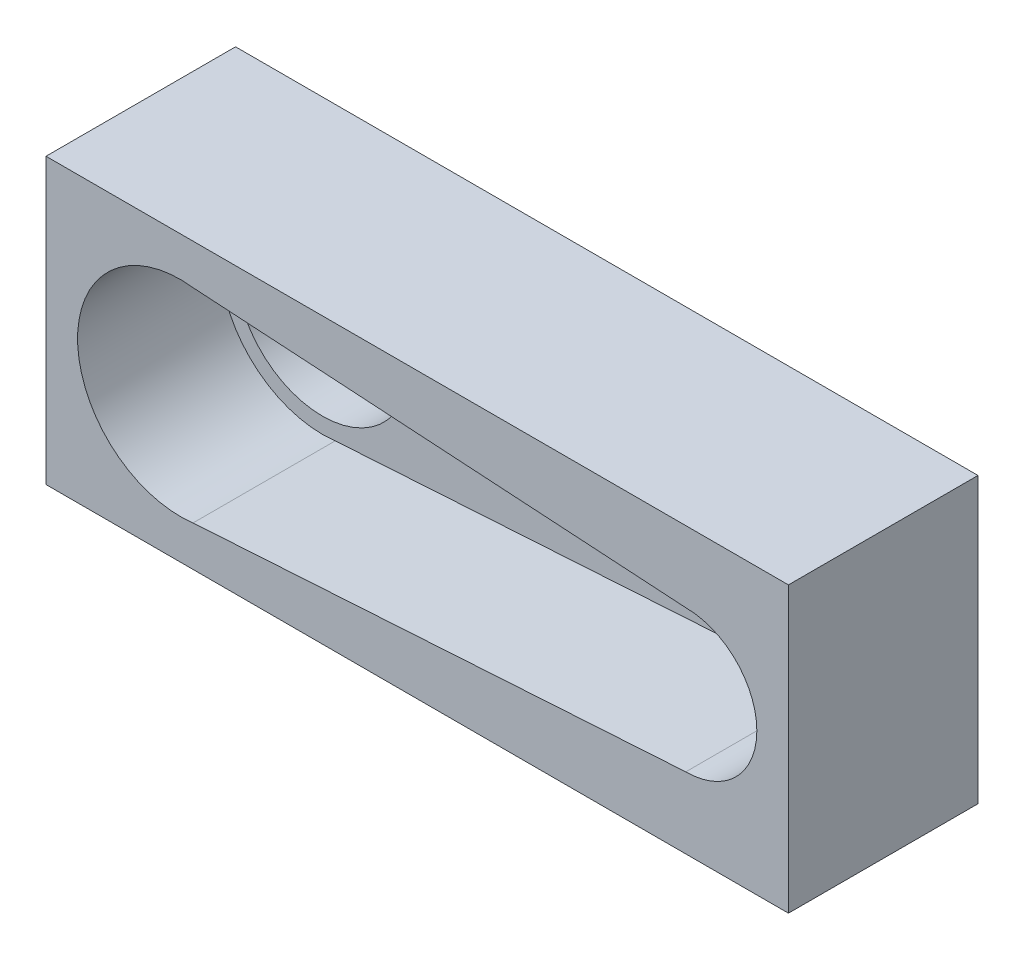
ISO-10303-21;
HEADER;
FILE_DESCRIPTION(('STEP AP214'),'2;1');
FILE_NAME('part.step','',(''),(''),'','','');
FILE_SCHEMA(('AUTOMOTIVE_DESIGN { 1 0 10303 214 1 1 1 1 }'));
ENDSEC;
DATA;
#1=APPLICATION_CONTEXT('core data for automotive mechanical design processes');
#2=APPLICATION_PROTOCOL_DEFINITION('international standard','automotive_design',2000,#1);
#3=PRODUCT_CONTEXT('',#1,'mechanical');
#4=PRODUCT('Part','Part','',(#3));
#5=PRODUCT_RELATED_PRODUCT_CATEGORY('part','',(#4));
#6=PRODUCT_DEFINITION_FORMATION('','',#4);
#7=PRODUCT_DEFINITION_CONTEXT('part definition',#1,'design');
#8=PRODUCT_DEFINITION('design','',#6,#7);
#9=PRODUCT_DEFINITION_SHAPE('','',#8);
#10=(LENGTH_UNIT() NAMED_UNIT(*) SI_UNIT(.MILLI.,.METRE.));
#11=(NAMED_UNIT(*) PLANE_ANGLE_UNIT() SI_UNIT($,.RADIAN.));
#12=(NAMED_UNIT(*) SI_UNIT($,.STERADIAN.) SOLID_ANGLE_UNIT());
#13=UNCERTAINTY_MEASURE_WITH_UNIT(LENGTH_MEASURE(1.E-05),#10,'distance_accuracy_value','');
#14=(GEOMETRIC_REPRESENTATION_CONTEXT(3) GLOBAL_UNCERTAINTY_ASSIGNED_CONTEXT((#13)) GLOBAL_UNIT_ASSIGNED_CONTEXT((#10,
#11,#12)) REPRESENTATION_CONTEXT('',''));
#15=CARTESIAN_POINT('',(0.,0.,0.));
#16=DIRECTION('',(0.,0.,1.));
#17=DIRECTION('',(1.,0.,0.));
#18=AXIS2_PLACEMENT_3D('',#15,#16,#17);
#19=CARTESIAN_POINT('',(0.,0.,9.));
#20=DIRECTION('',(-1.,0.,0.));
#21=DIRECTION('',(0.,-1.,0.));
#22=AXIS2_PLACEMENT_3D('',#19,#20,#21);
#23=PLANE('',#22);
#24=DIRECTION('',(0.,0.,-1.));
#25=VECTOR('',#24,1.);
#26=CARTESIAN_POINT('',(0.,18.,9.));
#27=LINE('',#26,#25);
#28=CARTESIAN_POINT('',(0.,18.,9.));
#29=VERTEX_POINT('',#28);
#30=CARTESIAN_POINT('',(0.,18.,-3.));
#31=VERTEX_POINT('',#30);
#32=EDGE_CURVE('E266',#29,#31,#27,.T.);
#33=ORIENTED_EDGE('',*,*,#32,.T.);
#34=DIRECTION('',(0.,1.,0.));
#35=VECTOR('',#34,1.);
#36=CARTESIAN_POINT('',(0.,0.,-3.));
#37=LINE('',#36,#35);
#38=CARTESIAN_POINT('',(0.,0.,-3.));
#39=VERTEX_POINT('',#38);
#40=EDGE_CURVE('E178',#39,#31,#37,.T.);
#41=ORIENTED_EDGE('',*,*,#40,.F.);
#42=DIRECTION('',(0.,0.,-1.));
#43=VECTOR('',#42,1.);
#44=CARTESIAN_POINT('',(0.,0.,9.));
#45=LINE('',#44,#43);
#46=CARTESIAN_POINT('',(0.,0.,9.));
#47=VERTEX_POINT('',#46);
#48=EDGE_CURVE('E11',#47,#39,#45,.T.);
#49=ORIENTED_EDGE('',*,*,#48,.F.);
#50=DIRECTION('',(0.,1.,0.));
#51=VECTOR('',#50,1.);
#52=CARTESIAN_POINT('',(0.,0.,9.));
#53=LINE('',#52,#51);
#54=EDGE_CURVE('E239',#47,#29,#53,.T.);
#55=ORIENTED_EDGE('',*,*,#54,.T.);
#56=EDGE_LOOP('',(#33,#41,#49,#55));
#57=FACE_BOUND('',#56,.T.);
#58=ADVANCED_FACE('F45',(#57),#23,.T.);
#59=CARTESIAN_POINT('',(0.,0.,9.));
#60=DIRECTION('',(0.,1.,0.));
#61=DIRECTION('',(0.,0.,1.));
#62=AXIS2_PLACEMENT_3D('',#59,#60,#61);
#63=PLANE('',#62);
#64=ORIENTED_EDGE('',*,*,#48,.T.);
#65=DIRECTION('',(1.,0.,0.));
#66=VECTOR('',#65,1.);
#67=CARTESIAN_POINT('',(0.,0.,-3.));
#68=LINE('',#67,#66);
#69=CARTESIAN_POINT('',(47.,0.,-3.));
#70=VERTEX_POINT('',#69);
#71=EDGE_CURVE('E182',#39,#70,#68,.T.);
#72=ORIENTED_EDGE('',*,*,#71,.T.);
#73=DIRECTION('',(0.,0.,-1.));
#74=VECTOR('',#73,1.);
#75=CARTESIAN_POINT('',(47.,0.,9.));
#76=LINE('',#75,#74);
#77=CARTESIAN_POINT('',(47.,0.,9.));
#78=VERTEX_POINT('',#77);
#79=EDGE_CURVE('E55',#78,#70,#76,.T.);
#80=ORIENTED_EDGE('',*,*,#79,.F.);
#81=DIRECTION('',(1.,0.,0.));
#82=VECTOR('',#81,1.);
#83=CARTESIAN_POINT('',(0.,0.,9.));
#84=LINE('',#83,#82);
#85=EDGE_CURVE('E243',#47,#78,#84,.T.);
#86=ORIENTED_EDGE('',*,*,#85,.F.);
#87=EDGE_LOOP('',(#64,#72,#80,#86));
#88=FACE_BOUND('',#87,.T.);
#89=ADVANCED_FACE('F320',(#88),#63,.F.);
#90=CARTESIAN_POINT('',(47.,0.,9.));
#91=DIRECTION('',(-1.,0.,0.));
#92=DIRECTION('',(0.,0.,1.));
#93=AXIS2_PLACEMENT_3D('',#90,#91,#92);
#94=PLANE('',#93);
#95=ORIENTED_EDGE('',*,*,#79,.T.);
#96=DIRECTION('',(0.,1.,0.));
#97=VECTOR('',#96,1.);
#98=CARTESIAN_POINT('',(47.,0.,-3.));
#99=LINE('',#98,#97);
#100=CARTESIAN_POINT('',(47.,18.,-3.));
#101=VERTEX_POINT('',#100);
#102=EDGE_CURVE('E186',#70,#101,#99,.T.);
#103=ORIENTED_EDGE('',*,*,#102,.T.);
#104=DIRECTION('',(0.,0.,-1.));
#105=VECTOR('',#104,1.);
#106=CARTESIAN_POINT('',(47.,18.,9.));
#107=LINE('',#106,#105);
#108=CARTESIAN_POINT('',(47.,18.,9.));
#109=VERTEX_POINT('',#108);
#110=EDGE_CURVE('E269',#109,#101,#107,.T.);
#111=ORIENTED_EDGE('',*,*,#110,.F.);
#112=DIRECTION('',(0.,1.,0.));
#113=VECTOR('',#112,1.);
#114=CARTESIAN_POINT('',(47.,0.,9.));
#115=LINE('',#114,#113);
#116=EDGE_CURVE('E247',#78,#109,#115,.T.);
#117=ORIENTED_EDGE('',*,*,#116,.F.);
#118=EDGE_LOOP('',(#95,#103,#111,#117));
#119=FACE_BOUND('',#118,.T.);
#120=ADVANCED_FACE('F317',(#119),#94,.F.);
#121=CARTESIAN_POINT('',(-0.122568093385214,1.96108949416342,9.));
#122=DIRECTION('',(0.0623782861551805,-0.998052578482889,0.));
#123=DIRECTION('',(0.998052578482889,0.0623782861551805,0.));
#124=AXIS2_PLACEMENT_3D('',#121,#122,#123);
#125=PLANE('',#124);
#126=DIRECTION('',(-0.998052578482889,-0.0623782861551805,0.));
#127=VECTOR('',#126,1.);
#128=CARTESIAN_POINT('',(-0.122568093385214,1.96108949416342,0.));
#129=LINE('',#128,#127);
#130=CARTESIAN_POINT('',(40.5,4.5,0.));
#131=VERTEX_POINT('',#130);
#132=CARTESIAN_POINT('',(9.30933852140075,2.55058365758754,0.));
#133=VERTEX_POINT('',#132);
#134=EDGE_CURVE('E219',#131,#133,#129,.T.);
#135=ORIENTED_EDGE('',*,*,#134,.T.);
#136=DIRECTION('',(0.,0.,-1.));
#137=VECTOR('',#136,1.);
#138=CARTESIAN_POINT('',(9.30933852140075,2.55058365758754,9.));
#139=LINE('',#138,#137);
#140=CARTESIAN_POINT('',(9.30933852140075,2.55058365758754,9.));
#141=VERTEX_POINT('',#140);
#142=EDGE_CURVE('E49',#141,#133,#139,.T.);
#143=ORIENTED_EDGE('',*,*,#142,.F.);
#144=DIRECTION('',(-0.998052578482889,-0.0623782861551805,0.));
#145=VECTOR('',#144,1.);
#146=CARTESIAN_POINT('',(-0.122568093385214,1.96108949416342,9.));
#147=LINE('',#146,#145);
#148=CARTESIAN_POINT('',(40.5,4.5,9.));
#149=VERTEX_POINT('',#148);
#150=EDGE_CURVE('E225',#149,#141,#147,.T.);
#151=ORIENTED_EDGE('',*,*,#150,.F.);
#152=DIRECTION('',(0.,0.,-1.));
#153=VECTOR('',#152,1.);
#154=CARTESIAN_POINT('',(40.5,4.5,9.));
#155=LINE('',#154,#153);
#156=EDGE_CURVE('E254',#149,#131,#155,.T.);
#157=ORIENTED_EDGE('',*,*,#156,.T.);
#158=EDGE_LOOP('',(#135,#143,#151,#157));
#159=FACE_BOUND('',#158,.T.);
#160=ADVANCED_FACE('F47',(#159),#125,.F.);
#161=CARTESIAN_POINT('',(8.5,9.,9.));
#162=DIRECTION('',(0.,0.,-1.));
#163=DIRECTION('',(-1.,0.,0.));
#164=AXIS2_PLACEMENT_3D('',#161,#162,#163);
#165=CYLINDRICAL_SURFACE('',#164,6.5);
#166=CARTESIAN_POINT('',(8.5,9.,0.));
#167=DIRECTION('',(0.,0.,1.));
#168=DIRECTION('',(1.,0.,0.));
#169=AXIS2_PLACEMENT_3D('',#166,#167,#168);
#170=CIRCLE('',#169,6.5);
#171=CARTESIAN_POINT('',(8.5,15.5,0.));
#172=VERTEX_POINT('',#171);
#173=CARTESIAN_POINT('',(8.50000000000003,2.5,0.));
#174=VERTEX_POINT('',#173);
#175=EDGE_CURVE('E63',#172,#174,#170,.T.);
#176=ORIENTED_EDGE('',*,*,#175,.F.);
#177=DIRECTION('',(0.,0.,1.));
#178=VECTOR('',#177,1.);
#179=CARTESIAN_POINT('',(8.5,15.5,-3.));
#180=LINE('',#179,#178);
#181=CARTESIAN_POINT('',(8.5,15.5,-3.));
#182=VERTEX_POINT('',#181);
#183=EDGE_CURVE('E220',#182,#172,#180,.T.);
#184=ORIENTED_EDGE('',*,*,#183,.F.);
#185=CARTESIAN_POINT('',(8.5,9.,-3.));
#186=DIRECTION('',(0.,0.,1.));
#187=DIRECTION('',(1.,0.,0.));
#188=AXIS2_PLACEMENT_3D('',#185,#186,#187);
#189=CIRCLE('',#188,6.5);
#190=CARTESIAN_POINT('',(9.30933852140077,15.4494163424125,-3.));
#191=VERTEX_POINT('',#190);
#192=EDGE_CURVE('E163',#191,#182,#189,.T.);
#193=ORIENTED_EDGE('',*,*,#192,.F.);
#194=DIRECTION('',(0.,0.,1.));
#195=VECTOR('',#194,1.);
#196=CARTESIAN_POINT('',(9.30933852140077,15.4494163424125,-3.));
#197=LINE('',#196,#195);
#198=CARTESIAN_POINT('',(9.30933852140077,15.4494163424125,0.));
#199=VERTEX_POINT('',#198);
#200=EDGE_CURVE('E215',#191,#199,#197,.T.);
#201=ORIENTED_EDGE('',*,*,#200,.T.);
#202=DIRECTION('',(0.,0.,-1.));
#203=VECTOR('',#202,1.);
#204=CARTESIAN_POINT('',(9.30933852140077,15.4494163424125,9.));
#205=LINE('',#204,#203);
#206=CARTESIAN_POINT('',(9.30933852140077,15.4494163424125,9.));
#207=VERTEX_POINT('',#206);
#208=EDGE_CURVE('E278',#207,#199,#205,.T.);
#209=ORIENTED_EDGE('',*,*,#208,.F.);
#210=CARTESIAN_POINT('',(8.5,9.,9.));
#211=DIRECTION('',(0.,0.,1.));
#212=DIRECTION('',(1.,0.,0.));
#213=AXIS2_PLACEMENT_3D('',#210,#211,#212);
#214=CIRCLE('',#213,6.5);
#215=EDGE_CURVE('E228',#207,#141,#214,.T.);
#216=ORIENTED_EDGE('',*,*,#215,.T.);
#217=ORIENTED_EDGE('',*,*,#142,.T.);
#218=DIRECTION('',(0.,0.,1.));
#219=VECTOR('',#218,1.);
#220=CARTESIAN_POINT('',(9.30933852140075,2.55058365758754,-3.));
#221=LINE('',#220,#219);
#222=CARTESIAN_POINT('',(9.30933852140075,2.55058365758754,-3.));
#223=VERTEX_POINT('',#222);
#224=EDGE_CURVE('E141',#223,#133,#221,.T.);
#225=ORIENTED_EDGE('',*,*,#224,.F.);
#226=CARTESIAN_POINT('',(8.5,9.,-3.));
#227=DIRECTION('',(0.,0.,1.));
#228=DIRECTION('',(1.,0.,0.));
#229=AXIS2_PLACEMENT_3D('',#226,#227,#228);
#230=CIRCLE('',#229,6.5);
#231=CARTESIAN_POINT('',(8.5,2.5,-3.));
#232=VERTEX_POINT('',#231);
#233=EDGE_CURVE('E129',#232,#223,#230,.T.);
#234=ORIENTED_EDGE('',*,*,#233,.F.);
#235=DIRECTION('',(0.,0.,1.));
#236=VECTOR('',#235,1.);
#237=CARTESIAN_POINT('',(8.5,2.5,-3.));
#238=LINE('',#237,#236);
#239=EDGE_CURVE('E148',#232,#174,#238,.T.);
#240=ORIENTED_EDGE('',*,*,#239,.T.);
#241=EDGE_LOOP('',(#176,#184,#193,#201,#209,#216,#217,#225,#234,#240));
#242=FACE_BOUND('',#241,.T.);
#243=ADVANCED_FACE('F142',(#242),#165,.F.);
#244=CARTESIAN_POINT('',(0.99805447470817,15.9688715953307,9.));
#245=DIRECTION('',(0.0623782861551805,0.998052578482889,0.));
#246=DIRECTION('',(-0.998052578482889,0.0623782861551805,0.));
#247=AXIS2_PLACEMENT_3D('',#244,#245,#246);
#248=PLANE('',#247);
#249=DIRECTION('',(0.998052578482889,-0.0623782861551805,0.));
#250=VECTOR('',#249,1.);
#251=CARTESIAN_POINT('',(0.99805447470817,15.9688715953307,0.));
#252=LINE('',#251,#250);
#253=CARTESIAN_POINT('',(40.5,13.5,0.));
#254=VERTEX_POINT('',#253);
#255=EDGE_CURVE('E259',#199,#254,#252,.T.);
#256=ORIENTED_EDGE('',*,*,#255,.T.);
#257=DIRECTION('',(0.,0.,-1.));
#258=VECTOR('',#257,1.);
#259=CARTESIAN_POINT('',(40.5,13.5,9.));
#260=LINE('',#259,#258);
#261=CARTESIAN_POINT('',(40.5,13.5,9.));
#262=VERTEX_POINT('',#261);
#263=EDGE_CURVE('E276',#262,#254,#260,.T.);
#264=ORIENTED_EDGE('',*,*,#263,.F.);
#265=DIRECTION('',(0.998052578482889,-0.0623782861551805,0.));
#266=VECTOR('',#265,1.);
#267=CARTESIAN_POINT('',(0.99805447470817,15.9688715953307,9.));
#268=LINE('',#267,#266);
#269=EDGE_CURVE('E232',#207,#262,#268,.T.);
#270=ORIENTED_EDGE('',*,*,#269,.F.);
#271=ORIENTED_EDGE('',*,*,#208,.T.);
#272=EDGE_LOOP('',(#256,#264,#270,#271));
#273=FACE_BOUND('',#272,.T.);
#274=ADVANCED_FACE('F284',(#273),#248,.F.);
#275=CARTESIAN_POINT('',(40.5,9.,9.));
#276=DIRECTION('',(0.,0.,-1.));
#277=DIRECTION('',(-1.,0.,0.));
#278=AXIS2_PLACEMENT_3D('',#275,#276,#277);
#279=CYLINDRICAL_SURFACE('',#278,4.5);
#280=CARTESIAN_POINT('',(40.5,9.,0.));
#281=DIRECTION('',(0.,0.,1.));
#282=DIRECTION('',(1.,0.,0.));
#283=AXIS2_PLACEMENT_3D('',#280,#281,#282);
#284=CIRCLE('',#283,4.5);
#285=EDGE_CURVE('E229',#131,#254,#284,.T.);
#286=ORIENTED_EDGE('',*,*,#285,.F.);
#287=ORIENTED_EDGE('',*,*,#156,.F.);
#288=CARTESIAN_POINT('',(40.5,9.,9.));
#289=DIRECTION('',(0.,0.,1.));
#290=DIRECTION('',(1.,0.,0.));
#291=AXIS2_PLACEMENT_3D('',#288,#289,#290);
#292=CIRCLE('',#291,4.5);
#293=EDGE_CURVE('E235',#149,#262,#292,.T.);
#294=ORIENTED_EDGE('',*,*,#293,.T.);
#295=ORIENTED_EDGE('',*,*,#263,.T.);
#296=EDGE_LOOP('',(#286,#287,#294,#295));
#297=FACE_BOUND('',#296,.T.);
#298=ADVANCED_FACE('F332',(#297),#279,.F.);
#299=CARTESIAN_POINT('',(0.,18.,9.));
#300=DIRECTION('',(0.,1.,0.));
#301=DIRECTION('',(0.,0.,1.));
#302=AXIS2_PLACEMENT_3D('',#299,#300,#301);
#303=PLANE('',#302);
#304=ORIENTED_EDGE('',*,*,#110,.T.);
#305=DIRECTION('',(1.,0.,0.));
#306=VECTOR('',#305,1.);
#307=CARTESIAN_POINT('',(0.,18.,-3.));
#308=LINE('',#307,#306);
#309=EDGE_CURVE('E149',#31,#101,#308,.T.);
#310=ORIENTED_EDGE('',*,*,#309,.F.);
#311=ORIENTED_EDGE('',*,*,#32,.F.);
#312=DIRECTION('',(1.,0.,0.));
#313=VECTOR('',#312,1.);
#314=CARTESIAN_POINT('',(0.,18.,9.));
#315=LINE('',#314,#313);
#316=EDGE_CURVE('E250',#29,#109,#315,.T.);
#317=ORIENTED_EDGE('',*,*,#316,.T.);
#318=EDGE_LOOP('',(#304,#310,#311,#317));
#319=FACE_BOUND('',#318,.T.);
#320=ADVANCED_FACE('F314',(#319),#303,.T.);
#321=CARTESIAN_POINT('',(0.,0.,9.));
#322=DIRECTION('',(0.,0.,1.));
#323=DIRECTION('',(1.,0.,0.));
#324=AXIS2_PLACEMENT_3D('',#321,#322,#323);
#325=PLANE('',#324);
#326=ORIENTED_EDGE('',*,*,#150,.T.);
#327=ORIENTED_EDGE('',*,*,#215,.F.);
#328=ORIENTED_EDGE('',*,*,#269,.T.);
#329=ORIENTED_EDGE('',*,*,#293,.F.);
#330=EDGE_LOOP('',(#326,#327,#328,#329));
#331=FACE_BOUND('',#330,.T.);
#332=ORIENTED_EDGE('',*,*,#54,.F.);
#333=ORIENTED_EDGE('',*,*,#85,.T.);
#334=ORIENTED_EDGE('',*,*,#116,.T.);
#335=ORIENTED_EDGE('',*,*,#316,.F.);
#336=EDGE_LOOP('',(#332,#333,#334,#335));
#337=FACE_BOUND('',#336,.T.);
#338=ADVANCED_FACE('F322',(#331,#337),#325,.T.);
#339=CARTESIAN_POINT('',(0.,0.,0.));
#340=DIRECTION('',(0.,0.,1.));
#341=DIRECTION('',(1.,0.,0.));
#342=AXIS2_PLACEMENT_3D('',#339,#340,#341);
#343=PLANE('',#342);
#344=CARTESIAN_POINT('',(42.,9.,0.));
#345=DIRECTION('',(0.,0.,1.));
#346=DIRECTION('',(1.,0.,0.));
#347=AXIS2_PLACEMENT_3D('',#344,#345,#346);
#348=CIRCLE('',#347,0.749999999999999);
#349=CARTESIAN_POINT('',(42.75,9.,0.));
#350=VERTEX_POINT('',#349);
#351=EDGE_CURVE('E157',#350,#350,#348,.T.);
#352=ORIENTED_EDGE('',*,*,#351,.F.);
#353=EDGE_LOOP('',(#352));
#354=FACE_BOUND('',#353,.T.);
#355=CARTESIAN_POINT('',(36.5,9.,0.));
#356=DIRECTION('',(0.,0.,1.));
#357=DIRECTION('',(1.,0.,0.));
#358=AXIS2_PLACEMENT_3D('',#355,#356,#357);
#359=CIRCLE('',#358,0.749999999999999);
#360=CARTESIAN_POINT('',(37.25,9.,0.));
#361=VERTEX_POINT('',#360);
#362=EDGE_CURVE('E208',#361,#361,#359,.T.);
#363=ORIENTED_EDGE('',*,*,#362,.F.);
#364=EDGE_LOOP('',(#363));
#365=FACE_BOUND('',#364,.T.);
#366=CARTESIAN_POINT('',(31.,9.,0.));
#367=DIRECTION('',(0.,0.,1.));
#368=DIRECTION('',(1.,0.,0.));
#369=AXIS2_PLACEMENT_3D('',#366,#367,#368);
#370=CIRCLE('',#369,0.749999999999999);
#371=CARTESIAN_POINT('',(31.75,9.,0.));
#372=VERTEX_POINT('',#371);
#373=EDGE_CURVE('E204',#372,#372,#370,.T.);
#374=ORIENTED_EDGE('',*,*,#373,.F.);
#375=EDGE_LOOP('',(#374));
#376=FACE_BOUND('',#375,.T.);
#377=CARTESIAN_POINT('',(8.5,9.,0.));
#378=DIRECTION('',(0.,0.,1.));
#379=DIRECTION('',(1.,0.,0.));
#380=AXIS2_PLACEMENT_3D('',#377,#378,#379);
#381=CIRCLE('',#380,5.5);
#382=CARTESIAN_POINT('',(14.,9.,0.));
#383=VERTEX_POINT('',#382);
#384=EDGE_CURVE('E193',#383,#383,#381,.T.);
#385=ORIENTED_EDGE('',*,*,#384,.F.);
#386=EDGE_LOOP('',(#385));
#387=FACE_BOUND('',#386,.T.);
#388=ORIENTED_EDGE('',*,*,#134,.F.);
#389=ORIENTED_EDGE('',*,*,#285,.T.);
#390=ORIENTED_EDGE('',*,*,#255,.F.);
#391=DIRECTION('',(0.998052578482889,-0.0623782861551805,0.));
#392=VECTOR('',#391,1.);
#393=CARTESIAN_POINT('',(0.99805447470817,15.9688715953307,0.));
#394=LINE('',#393,#392);
#395=EDGE_CURVE('E200',#172,#199,#394,.T.);
#396=ORIENTED_EDGE('',*,*,#395,.F.);
#397=ORIENTED_EDGE('',*,*,#175,.T.);
#398=DIRECTION('',(-0.998052578482889,-0.0623782861551805,0.));
#399=VECTOR('',#398,1.);
#400=CARTESIAN_POINT('',(-0.122568093385214,1.96108949416342,0.));
#401=LINE('',#400,#399);
#402=EDGE_CURVE('E197',#133,#174,#401,.T.);
#403=ORIENTED_EDGE('',*,*,#402,.F.);
#404=EDGE_LOOP('',(#388,#389,#390,#396,#397,#403));
#405=FACE_BOUND('',#404,.T.);
#406=ADVANCED_FACE('F288',(#354,#365,#376,#387,#405),#343,.T.);
#407=CARTESIAN_POINT('',(0.99805447470817,15.9688715953307,-3.));
#408=DIRECTION('',(-0.0623782861551805,-0.998052578482889,0.));
#409=DIRECTION('',(0.998052578482889,-0.0623782861551805,0.));
#410=AXIS2_PLACEMENT_3D('',#407,#408,#409);
#411=PLANE('',#410);
#412=ORIENTED_EDGE('',*,*,#395,.T.);
#413=ORIENTED_EDGE('',*,*,#200,.F.);
#414=DIRECTION('',(0.998052578482889,-0.0623782861551805,0.));
#415=VECTOR('',#414,1.);
#416=CARTESIAN_POINT('',(0.99805447470817,15.9688715953307,-3.));
#417=LINE('',#416,#415);
#418=EDGE_CURVE('E137',#182,#191,#417,.T.);
#419=ORIENTED_EDGE('',*,*,#418,.F.);
#420=ORIENTED_EDGE('',*,*,#183,.T.);
#421=EDGE_LOOP('',(#412,#413,#419,#420));
#422=FACE_BOUND('',#421,.T.);
#423=ADVANCED_FACE('F293',(#422),#411,.F.);
#424=CARTESIAN_POINT('',(-0.122568093385214,1.96108949416342,-3.));
#425=DIRECTION('',(-0.0623782861551805,0.998052578482889,0.));
#426=DIRECTION('',(-0.998052578482889,-0.0623782861551805,0.));
#427=AXIS2_PLACEMENT_3D('',#424,#425,#426);
#428=PLANE('',#427);
#429=ORIENTED_EDGE('',*,*,#402,.T.);
#430=ORIENTED_EDGE('',*,*,#239,.F.);
#431=DIRECTION('',(-0.998052578482889,-0.0623782861551805,0.));
#432=VECTOR('',#431,1.);
#433=CARTESIAN_POINT('',(-0.122568093385214,1.96108949416342,-3.));
#434=LINE('',#433,#432);
#435=EDGE_CURVE('E134',#223,#232,#434,.T.);
#436=ORIENTED_EDGE('',*,*,#435,.F.);
#437=ORIENTED_EDGE('',*,*,#224,.T.);
#438=EDGE_LOOP('',(#429,#430,#436,#437));
#439=FACE_BOUND('',#438,.T.);
#440=ADVANCED_FACE('F151',(#439),#428,.F.);
#441=CARTESIAN_POINT('',(42.,9.,-3.));
#442=DIRECTION('',(0.,0.,1.));
#443=DIRECTION('',(1.,0.,0.));
#444=AXIS2_PLACEMENT_3D('',#441,#442,#443);
#445=CYLINDRICAL_SURFACE('',#444,0.749999999999999);
#446=CARTESIAN_POINT('',(42.,9.,-3.));
#447=DIRECTION('',(0.,0.,1.));
#448=DIRECTION('',(1.,0.,0.));
#449=AXIS2_PLACEMENT_3D('',#446,#447,#448);
#450=CIRCLE('',#449,0.749999999999999);
#451=CARTESIAN_POINT('',(42.75,9.,-3.));
#452=VERTEX_POINT('',#451);
#453=EDGE_CURVE('E174',#452,#452,#450,.T.);
#454=ORIENTED_EDGE('',*,*,#453,.F.);
#455=EDGE_LOOP('',(#454));
#456=FACE_BOUND('',#455,.T.);
#457=ORIENTED_EDGE('',*,*,#351,.T.);
#458=EDGE_LOOP('',(#457));
#459=FACE_BOUND('',#458,.T.);
#460=ADVANCED_FACE('F465',(#456,#459),#445,.F.);
#461=CARTESIAN_POINT('',(36.5,9.,-3.));
#462=DIRECTION('',(0.,0.,1.));
#463=DIRECTION('',(1.,0.,0.));
#464=AXIS2_PLACEMENT_3D('',#461,#462,#463);
#465=CYLINDRICAL_SURFACE('',#464,0.749999999999999);
#466=CARTESIAN_POINT('',(36.5,9.,-3.));
#467=DIRECTION('',(0.,0.,1.));
#468=DIRECTION('',(1.,0.,0.));
#469=AXIS2_PLACEMENT_3D('',#466,#467,#468);
#470=CIRCLE('',#469,0.749999999999999);
#471=CARTESIAN_POINT('',(37.25,9.,-3.));
#472=VERTEX_POINT('',#471);
#473=EDGE_CURVE('E170',#472,#472,#470,.T.);
#474=ORIENTED_EDGE('',*,*,#473,.F.);
#475=EDGE_LOOP('',(#474));
#476=FACE_BOUND('',#475,.T.);
#477=ORIENTED_EDGE('',*,*,#362,.T.);
#478=EDGE_LOOP('',(#477));
#479=FACE_BOUND('',#478,.T.);
#480=ADVANCED_FACE('F475',(#476,#479),#465,.F.);
#481=CARTESIAN_POINT('',(31.,9.,-3.));
#482=DIRECTION('',(0.,0.,1.));
#483=DIRECTION('',(1.,0.,0.));
#484=AXIS2_PLACEMENT_3D('',#481,#482,#483);
#485=CYLINDRICAL_SURFACE('',#484,0.749999999999999);
#486=CARTESIAN_POINT('',(31.,9.,-3.));
#487=DIRECTION('',(0.,0.,1.));
#488=DIRECTION('',(1.,0.,0.));
#489=AXIS2_PLACEMENT_3D('',#486,#487,#488);
#490=CIRCLE('',#489,0.749999999999999);
#491=CARTESIAN_POINT('',(31.75,9.,-3.));
#492=VERTEX_POINT('',#491);
#493=EDGE_CURVE('E166',#492,#492,#490,.T.);
#494=ORIENTED_EDGE('',*,*,#493,.F.);
#495=EDGE_LOOP('',(#494));
#496=FACE_BOUND('',#495,.T.);
#497=ORIENTED_EDGE('',*,*,#373,.T.);
#498=EDGE_LOOP('',(#497));
#499=FACE_BOUND('',#498,.T.);
#500=ADVANCED_FACE('F486',(#496,#499),#485,.F.);
#501=CARTESIAN_POINT('',(8.5,9.,-3.));
#502=DIRECTION('',(0.,0.,1.));
#503=DIRECTION('',(1.,0.,0.));
#504=AXIS2_PLACEMENT_3D('',#501,#502,#503);
#505=CYLINDRICAL_SURFACE('',#504,5.5);
#506=CARTESIAN_POINT('',(8.5,9.,-3.));
#507=DIRECTION('',(0.,0.,1.));
#508=DIRECTION('',(1.,0.,0.));
#509=AXIS2_PLACEMENT_3D('',#506,#507,#508);
#510=CIRCLE('',#509,5.5);
#511=CARTESIAN_POINT('',(14.,9.,-3.));
#512=VERTEX_POINT('',#511);
#513=EDGE_CURVE('E153',#512,#512,#510,.T.);
#514=ORIENTED_EDGE('',*,*,#513,.F.);
#515=EDGE_LOOP('',(#514));
#516=FACE_BOUND('',#515,.T.);
#517=ORIENTED_EDGE('',*,*,#384,.T.);
#518=EDGE_LOOP('',(#517));
#519=FACE_BOUND('',#518,.T.);
#520=ADVANCED_FACE('F296',(#516,#519),#505,.F.);
#521=CARTESIAN_POINT('',(0.,0.,-3.));
#522=DIRECTION('',(0.,0.,1.));
#523=DIRECTION('',(1.,0.,0.));
#524=AXIS2_PLACEMENT_3D('',#521,#522,#523);
#525=PLANE('',#524);
#526=ORIENTED_EDGE('',*,*,#513,.T.);
#527=EDGE_LOOP('',(#526));
#528=FACE_BOUND('',#527,.T.);
#529=ORIENTED_EDGE('',*,*,#435,.T.);
#530=ORIENTED_EDGE('',*,*,#233,.T.);
#531=EDGE_LOOP('',(#529,#530));
#532=FACE_BOUND('',#531,.T.);
#533=ORIENTED_EDGE('',*,*,#418,.T.);
#534=ORIENTED_EDGE('',*,*,#192,.T.);
#535=EDGE_LOOP('',(#533,#534));
#536=FACE_BOUND('',#535,.T.);
#537=ORIENTED_EDGE('',*,*,#493,.T.);
#538=EDGE_LOOP('',(#537));
#539=FACE_BOUND('',#538,.T.);
#540=ORIENTED_EDGE('',*,*,#473,.T.);
#541=EDGE_LOOP('',(#540));
#542=FACE_BOUND('',#541,.T.);
#543=ORIENTED_EDGE('',*,*,#453,.T.);
#544=EDGE_LOOP('',(#543));
#545=FACE_BOUND('',#544,.T.);
#546=ORIENTED_EDGE('',*,*,#40,.T.);
#547=ORIENTED_EDGE('',*,*,#309,.T.);
#548=ORIENTED_EDGE('',*,*,#102,.F.);
#549=ORIENTED_EDGE('',*,*,#71,.F.);
#550=EDGE_LOOP('',(#546,#547,#548,#549));
#551=FACE_BOUND('',#550,.T.);
#552=ADVANCED_FACE('F131',(#528,#532,#536,#539,#542,#545,#551),#525,.F.);
#553=CLOSED_SHELL('',(#58,#89,#120,#160,#243,#274,#298,#320,#338,#406,#423,#440,#460,#480,#500,
#520,#552));
#554=MANIFOLD_SOLID_BREP('B2',#553);
#555=ADVANCED_BREP_SHAPE_REPRESENTATION('',(#18,#554),#14);
#556=SHAPE_DEFINITION_REPRESENTATION(#9,#555);
ENDSEC;
END-ISO-10303-21;
